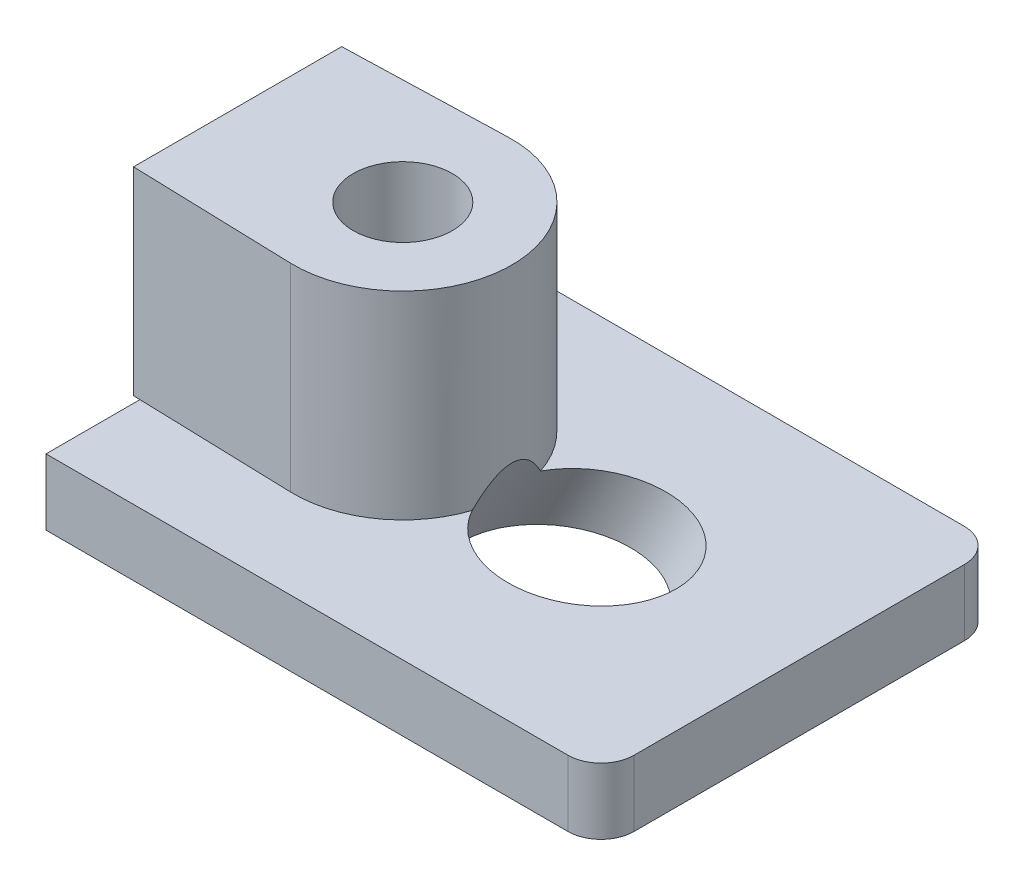
ISO-10303-21;
HEADER;
FILE_DESCRIPTION(('STEP AP214'),'2;1');
FILE_NAME('part.step','',(''),(''),'','','');
FILE_SCHEMA(('AUTOMOTIVE_DESIGN { 1 0 10303 214 1 1 1 1 }'));
ENDSEC;
DATA;
#1=APPLICATION_CONTEXT('core data for automotive mechanical design processes');
#2=APPLICATION_PROTOCOL_DEFINITION('international standard','automotive_design',2000,#1);
#3=PRODUCT_CONTEXT('',#1,'mechanical');
#4=PRODUCT('Part','Part','',(#3));
#5=PRODUCT_RELATED_PRODUCT_CATEGORY('part','',(#4));
#6=PRODUCT_DEFINITION_FORMATION('','',#4);
#7=PRODUCT_DEFINITION_CONTEXT('part definition',#1,'design');
#8=PRODUCT_DEFINITION('design','',#6,#7);
#9=PRODUCT_DEFINITION_SHAPE('','',#8);
#10=(LENGTH_UNIT() NAMED_UNIT(*) SI_UNIT(.MILLI.,.METRE.));
#11=(NAMED_UNIT(*) PLANE_ANGLE_UNIT() SI_UNIT($,.RADIAN.));
#12=(NAMED_UNIT(*) SI_UNIT($,.STERADIAN.) SOLID_ANGLE_UNIT());
#13=UNCERTAINTY_MEASURE_WITH_UNIT(LENGTH_MEASURE(1.E-05),#10,'distance_accuracy_value','');
#14=(GEOMETRIC_REPRESENTATION_CONTEXT(3) GLOBAL_UNCERTAINTY_ASSIGNED_CONTEXT((#13)) GLOBAL_UNIT_ASSIGNED_CONTEXT((#10,
#11,#12)) REPRESENTATION_CONTEXT('',''));
#15=CARTESIAN_POINT('',(0.,0.,0.));
#16=DIRECTION('',(0.,0.,1.));
#17=DIRECTION('',(1.,0.,0.));
#18=AXIS2_PLACEMENT_3D('',#15,#16,#17);
#19=CARTESIAN_POINT('',(2.5,7.75,0.));
#20=DIRECTION('',(0.,1.,0.));
#21=DIRECTION('',(0.,0.,1.));
#22=AXIS2_PLACEMENT_3D('',#19,#20,#21);
#23=PLANE('',#22);
#24=DIRECTION('',(0.,0.,-1.));
#25=VECTOR('',#24,1.);
#26=CARTESIAN_POINT('',(1.30000000001017,7.75,1.49999999996326));
#27=LINE('',#26,#25);
#28=CARTESIAN_POINT('',(1.30000000001017,7.75,0.789194940442877));
#29=VERTEX_POINT('',#28);
#30=CARTESIAN_POINT('',(1.30000000001017,7.75,-0.789194940442877));
#31=VERTEX_POINT('',#30);
#32=EDGE_CURVE('E175',#29,#31,#27,.T.);
#33=ORIENTED_EDGE('',*,*,#32,.F.);
#34=DIRECTION('',(0.99954579976556,0.,0.0301362600703334));
#35=VECTOR('',#34,1.);
#36=CARTESIAN_POINT('',(2.47513758544198,7.75,0.824625284806589));
#37=LINE('',#36,#35);
#38=CARTESIAN_POINT('',(1.25000000001017,7.75,0.787687442733547));
#39=VERTEX_POINT('',#38);
#40=EDGE_CURVE('E161',#39,#29,#37,.T.);
#41=ORIENTED_EDGE('',*,*,#40,.F.);
#42=DIRECTION('',(0.,0.,1.));
#43=VECTOR('',#42,1.);
#44=CARTESIAN_POINT('',(1.25000000001017,7.75,0.787687442733547));
#45=LINE('',#44,#43);
#46=CARTESIAN_POINT('',(1.25000000001017,7.75,-0.787687442733547));
#47=VERTEX_POINT('',#46);
#48=EDGE_CURVE('E158',#47,#39,#45,.T.);
#49=ORIENTED_EDGE('',*,*,#48,.F.);
#50=DIRECTION('',(-0.99954579976556,0.,0.0301362600703315));
#51=VECTOR('',#50,1.);
#52=CARTESIAN_POINT('',(1.25000000001017,7.75,-0.787687442733547));
#53=LINE('',#52,#51);
#54=EDGE_CURVE('E149',#31,#47,#53,.T.);
#55=ORIENTED_EDGE('',*,*,#54,.F.);
#56=EDGE_LOOP('',(#33,#41,#49,#55));
#57=FACE_BOUND('',#56,.T.);
#58=ADVANCED_FACE('F39',(#57),#23,.F.);
#59=CARTESIAN_POINT('',(2.5,9.25,0.));
#60=DIRECTION('',(0.,1.,0.));
#61=DIRECTION('',(0.,0.,1.));
#62=AXIS2_PLACEMENT_3D('',#59,#60,#61);
#63=PLANE('',#62);
#64=CARTESIAN_POINT('',(2.5,9.25,0.));
#65=DIRECTION('',(0.,1.,0.));
#66=DIRECTION('',(0.,0.,1.));
#67=AXIS2_PLACEMENT_3D('',#64,#65,#66);
#68=CIRCLE('',#67,0.825000000000001);
#69=CARTESIAN_POINT('',(2.47513758544198,9.25,0.824625284806589));
#70=VERTEX_POINT('',#69);
#71=CARTESIAN_POINT('',(2.47513758544198,9.25,-0.824625284806588));
#72=VERTEX_POINT('',#71);
#73=EDGE_CURVE('E164',#70,#72,#68,.T.);
#74=ORIENTED_EDGE('',*,*,#73,.T.);
#75=DIRECTION('',(-0.99954579976556,0.,0.0301362600703315));
#76=VECTOR('',#75,1.);
#77=CARTESIAN_POINT('',(1.25000000001017,9.25,-0.787687442733547));
#78=LINE('',#77,#76);
#79=CARTESIAN_POINT('',(1.25000000001017,9.25,-0.787687442733547));
#80=VERTEX_POINT('',#79);
#81=EDGE_CURVE('E229',#72,#80,#78,.T.);
#82=ORIENTED_EDGE('',*,*,#81,.T.);
#83=DIRECTION('',(0.,0.,1.));
#84=VECTOR('',#83,1.);
#85=CARTESIAN_POINT('',(1.25000000001017,9.25,0.787687442733547));
#86=LINE('',#85,#84);
#87=CARTESIAN_POINT('',(1.25000000001017,9.25,0.787687442733547));
#88=VERTEX_POINT('',#87);
#89=EDGE_CURVE('E230',#80,#88,#86,.T.);
#90=ORIENTED_EDGE('',*,*,#89,.T.);
#91=DIRECTION('',(0.99954579976556,0.,0.0301362600703334));
#92=VECTOR('',#91,1.);
#93=CARTESIAN_POINT('',(2.47513758544198,9.25,0.824625284806589));
#94=LINE('',#93,#92);
#95=EDGE_CURVE('E155',#88,#70,#94,.T.);
#96=ORIENTED_EDGE('',*,*,#95,.T.);
#97=EDGE_LOOP('',(#74,#82,#90,#96));
#98=FACE_BOUND('',#97,.T.);
#99=CARTESIAN_POINT('',(2.5,9.25,0.));
#100=DIRECTION('',(0.,1.,0.));
#101=DIRECTION('',(0.,0.,1.));
#102=AXIS2_PLACEMENT_3D('',#99,#100,#101);
#103=CIRCLE('',#102,0.374999999999997);
#104=CARTESIAN_POINT('',(2.5,9.25,0.374999999999998));
#105=VERTEX_POINT('',#104);
#106=EDGE_CURVE('E147',#105,#105,#103,.T.);
#107=ORIENTED_EDGE('',*,*,#106,.F.);
#108=EDGE_LOOP('',(#107));
#109=FACE_BOUND('',#108,.T.);
#110=ADVANCED_FACE('F236',(#98,#109),#63,.T.);
#111=CARTESIAN_POINT('',(2.5,9.25,0.));
#112=DIRECTION('',(0.,-1.,0.));
#113=DIRECTION('',(0.,0.,-1.));
#114=AXIS2_PLACEMENT_3D('',#111,#112,#113);
#115=CYLINDRICAL_SURFACE('',#114,0.825000000000001);
#116=CARTESIAN_POINT('',(2.5,7.75,0.));
#117=DIRECTION('',(0.,1.,0.));
#118=DIRECTION('',(0.,0.,1.));
#119=AXIS2_PLACEMENT_3D('',#116,#117,#118);
#120=CIRCLE('',#119,0.825000000000001);
#121=CARTESIAN_POINT('',(2.47513758544198,7.75,0.824625284806589));
#122=VERTEX_POINT('',#121);
#123=CARTESIAN_POINT('',(3.28350083011511,7.75,0.258363018268751));
#124=VERTEX_POINT('',#123);
#125=EDGE_CURVE('E140',#122,#124,#120,.T.);
#126=ORIENTED_EDGE('',*,*,#125,.T.);
#127=CARTESIAN_POINT('',(3.28350083011511,7.75,0.258363018268751));
#128=CARTESIAN_POINT('',(3.28699629386318,7.76737167610386,0.247717695795738));
#129=CARTESIAN_POINT('',(3.29045746397857,7.78448758146414,0.236535022142881));
#130=CARTESIAN_POINT('',(3.29729263029284,7.81815195159373,0.212408271554127));
#131=CARTESIAN_POINT('',(3.30066185739445,7.83467320491001,0.199425248176803));
#132=CARTESIAN_POINT('',(3.30711403044603,7.86619807139703,0.171461122570829));
#133=CARTESIAN_POINT('',(3.3101953340927,7.88119301733646,0.156469620021037));
#134=CARTESIAN_POINT('',(3.31577706571615,7.90827880066202,0.12409020915238));
#135=CARTESIAN_POINT('',(3.31828357965726,7.92040011589495,0.106730843363557));
#136=CARTESIAN_POINT('',(3.32127084558138,7.9348215765627,0.078888319291892));
#137=CARTESIAN_POINT('',(3.32213260135721,7.93897685197716,0.0694173488184401));
#138=CARTESIAN_POINT('',(3.32354615738824,7.94578891480867,0.0499200886748));
#139=CARTESIAN_POINT('',(3.32409815277136,7.94844664558094,0.0398941529782842));
#140=CARTESIAN_POINT('',(3.32483491132341,7.95199328219456,0.0194333412467662));
#141=CARTESIAN_POINT('',(3.32501688143136,7.9528687349283,0.00899595677292852));
#142=CARTESIAN_POINT('',(3.32498062707693,7.95269427559985,-0.0118633448696995));
#143=CARTESIAN_POINT('',(3.3247623547405,7.95164413321211,-0.0222852600389345));
#144=CARTESIAN_POINT('',(3.32398893632226,7.94792075450384,-0.0419008258318313));
#145=CARTESIAN_POINT('',(3.32346365554792,7.94539140172208,-0.051124074716937));
#146=CARTESIAN_POINT('',(3.32215104739102,7.93906567007573,-0.0690934351013585));
#147=CARTESIAN_POINT('',(3.32136374259963,7.93526940044204,-0.0778395876593046));
#148=CARTESIAN_POINT('',(3.31897190754394,7.92372402533821,-0.100578862908204));
#149=CARTESIAN_POINT('',(3.31717642734045,7.91504579337111,-0.114077082987651));
#150=CARTESIAN_POINT('',(3.31319719530162,7.89576674373529,-0.139658737731793));
#151=CARTESIAN_POINT('',(3.31101040177495,7.88515085059979,-0.151729761073551));
#152=CARTESIAN_POINT('',(3.30488396314836,7.8553267768583,-0.182105092880801));
#153=CARTESIAN_POINT('',(3.30073520753249,7.83504904238653,-0.199306386547059));
#154=CARTESIAN_POINT('',(3.29433648114911,7.80360095863935,-0.222974308083464));
#155=CARTESIAN_POINT('',(3.29220407060575,7.79309406405001,-0.23042152060526));
#156=CARTESIAN_POINT('',(3.28788815438002,7.77176907325318,-0.244771662623246));
#157=CARTESIAN_POINT('',(3.28570481309643,7.76095195786056,-0.25167609438423));
#158=CARTESIAN_POINT('',(3.28350083011511,7.75,-0.25836301826875));
#159=B_SPLINE_CURVE_WITH_KNOTS('',3,(#127,#128,#129,#130,#131,#132,#133,#134,#135,#136,#137,
#138,#139,#140,#141,#142,#143,#144,#145,#146,#147,#148,#149,#150,#151,#152,#153,#154,#155,#156,
#157,#158),.UNSPECIFIED.,.F.,.F.,(4,2,2,2,2,2,2,2,2,2,2,2,2,2,2,4),(0.,0.062094270264768,
0.125840542327223,0.189930676463519,0.25330717207321,0.28433894797483,0.315351153969684,
0.346596593157475,0.377845769939032,0.406467691734564,0.435087146445606,0.483247703954784,
0.531800305579684,0.612190537944448,0.651346958262196,0.690390881410285),.UNSPECIFIED.);
#160=CARTESIAN_POINT('',(3.28350083011511,7.75,-0.25836301826875));
#161=VERTEX_POINT('',#160);
#162=EDGE_CURVE('E54',#124,#161,#159,.T.);
#163=ORIENTED_EDGE('',*,*,#162,.T.);
#164=CARTESIAN_POINT('',(2.47513758544198,7.75,-0.824625284806588));
#165=VERTEX_POINT('',#164);
#166=EDGE_CURVE('E137',#161,#165,#120,.T.);
#167=ORIENTED_EDGE('',*,*,#166,.T.);
#168=DIRECTION('',(0.,-1.,0.));
#169=VECTOR('',#168,1.);
#170=CARTESIAN_POINT('',(2.47513758544198,9.25,-0.824625284806588));
#171=LINE('',#170,#169);
#172=EDGE_CURVE('E173',#72,#165,#171,.T.);
#173=ORIENTED_EDGE('',*,*,#172,.F.);
#174=ORIENTED_EDGE('',*,*,#73,.F.);
#175=DIRECTION('',(0.,-1.,0.));
#176=VECTOR('',#175,1.);
#177=CARTESIAN_POINT('',(2.47513758544198,9.25,0.824625284806589));
#178=LINE('',#177,#176);
#179=EDGE_CURVE('E165',#70,#122,#178,.T.);
#180=ORIENTED_EDGE('',*,*,#179,.T.);
#181=EDGE_LOOP('',(#126,#163,#167,#173,#174,#180));
#182=FACE_BOUND('',#181,.T.);
#183=ADVANCED_FACE('F135',(#182),#115,.T.);
#184=CARTESIAN_POINT('',(1.25000000001017,9.25,-0.787687442733547));
#185=DIRECTION('',(0.0301362600703315,0.,0.99954579976556));
#186=DIRECTION('',(0.99954579976556,0.,-0.0301362600703315));
#187=AXIS2_PLACEMENT_3D('',#184,#185,#186);
#188=PLANE('',#187);
#189=EDGE_CURVE('E146',#165,#31,#53,.T.);
#190=ORIENTED_EDGE('',*,*,#189,.T.);
#191=ORIENTED_EDGE('',*,*,#54,.T.);
#192=DIRECTION('',(0.,-1.,0.));
#193=VECTOR('',#192,1.);
#194=CARTESIAN_POINT('',(1.25000000001017,9.25,-0.787687442733547));
#195=LINE('',#194,#193);
#196=EDGE_CURVE('E170',#80,#47,#195,.T.);
#197=ORIENTED_EDGE('',*,*,#196,.F.);
#198=ORIENTED_EDGE('',*,*,#81,.F.);
#199=ORIENTED_EDGE('',*,*,#172,.T.);
#200=EDGE_LOOP('',(#190,#191,#197,#198,#199));
#201=FACE_BOUND('',#200,.T.);
#202=ADVANCED_FACE('F243',(#201),#188,.F.);
#203=CARTESIAN_POINT('',(1.25000000001017,9.25,0.787687442733547));
#204=DIRECTION('',(1.,0.,0.));
#205=DIRECTION('',(0.,0.,-1.));
#206=AXIS2_PLACEMENT_3D('',#203,#204,#205);
#207=PLANE('',#206);
#208=ORIENTED_EDGE('',*,*,#48,.T.);
#209=DIRECTION('',(0.,-1.,0.));
#210=VECTOR('',#209,1.);
#211=CARTESIAN_POINT('',(1.25000000001017,9.25,0.787687442733547));
#212=LINE('',#211,#210);
#213=EDGE_CURVE('E167',#88,#39,#212,.T.);
#214=ORIENTED_EDGE('',*,*,#213,.F.);
#215=ORIENTED_EDGE('',*,*,#89,.F.);
#216=ORIENTED_EDGE('',*,*,#196,.T.);
#217=EDGE_LOOP('',(#208,#214,#215,#216));
#218=FACE_BOUND('',#217,.T.);
#219=ADVANCED_FACE('F248',(#218),#207,.F.);
#220=CARTESIAN_POINT('',(2.47513758544198,9.25,0.824625284806589));
#221=DIRECTION('',(0.0301362600703333,0.,-0.99954579976556));
#222=DIRECTION('',(-0.99954579976556,0.,-0.0301362600703334));
#223=AXIS2_PLACEMENT_3D('',#220,#221,#222);
#224=PLANE('',#223);
#225=ORIENTED_EDGE('',*,*,#40,.T.);
#226=EDGE_CURVE('E160',#29,#122,#37,.T.);
#227=ORIENTED_EDGE('',*,*,#226,.T.);
#228=ORIENTED_EDGE('',*,*,#179,.F.);
#229=ORIENTED_EDGE('',*,*,#95,.F.);
#230=ORIENTED_EDGE('',*,*,#213,.T.);
#231=EDGE_LOOP('',(#225,#227,#228,#229,#230));
#232=FACE_BOUND('',#231,.T.);
#233=ADVANCED_FACE('F240',(#232),#224,.F.);
#234=CARTESIAN_POINT('',(2.5,9.25,0.));
#235=DIRECTION('',(0.,-1.,0.));
#236=DIRECTION('',(0.,0.,-1.));
#237=AXIS2_PLACEMENT_3D('',#234,#235,#236);
#238=CYLINDRICAL_SURFACE('',#237,0.374999999999997);
#239=ORIENTED_EDGE('',*,*,#106,.T.);
#240=EDGE_LOOP('',(#239));
#241=FACE_BOUND('',#240,.T.);
#242=CARTESIAN_POINT('',(2.5,7.75,0.));
#243=DIRECTION('',(0.,1.,0.));
#244=DIRECTION('',(0.,0.,1.));
#245=AXIS2_PLACEMENT_3D('',#242,#243,#244);
#246=CIRCLE('',#245,0.374999999999997);
#247=CARTESIAN_POINT('',(2.5,7.75,0.374999999999998));
#248=VERTEX_POINT('',#247);
#249=EDGE_CURVE('E151',#248,#248,#246,.T.);
#250=ORIENTED_EDGE('',*,*,#249,.F.);
#251=EDGE_LOOP('',(#250));
#252=FACE_BOUND('',#251,.T.);
#253=ADVANCED_FACE('F279',(#241,#252),#238,.F.);
#254=CARTESIAN_POINT('',(0.,7.75,0.));
#255=DIRECTION('',(0.,-1.,0.));
#256=DIRECTION('',(1.,0.,0.));
#257=AXIS2_PLACEMENT_3D('',#254,#255,#256);
#258=PLANE('',#257);
#259=ORIENTED_EDGE('',*,*,#166,.F.);
#260=CARTESIAN_POINT('',(3.89333333334351,7.75,0.));
#261=DIRECTION('',(0.,-1.,0.));
#262=DIRECTION('',(1.,0.,0.));
#263=AXIS2_PLACEMENT_3D('',#260,#261,#262);
#264=ELLIPSE('',#263,0.676486666600938,0.596899999942004);
#265=EDGE_CURVE('E127',#161,#124,#264,.T.);
#266=ORIENTED_EDGE('',*,*,#265,.T.);
#267=ORIENTED_EDGE('',*,*,#125,.F.);
#268=ORIENTED_EDGE('',*,*,#226,.F.);
#269=CARTESIAN_POINT('',(1.30000000001017,7.75,1.49999999996326));
#270=VERTEX_POINT('',#269);
#271=EDGE_CURVE('E214',#270,#29,#27,.T.);
#272=ORIENTED_EDGE('',*,*,#271,.F.);
#273=DIRECTION('',(-1.,0.,0.));
#274=VECTOR('',#273,1.);
#275=CARTESIAN_POINT('',(5.50000000001019,7.75,1.49999999996326));
#276=LINE('',#275,#274);
#277=CARTESIAN_POINT('',(5.25000000001019,7.75,1.49999999996326));
#278=VERTEX_POINT('',#277);
#279=EDGE_CURVE('E253',#278,#270,#276,.T.);
#280=ORIENTED_EDGE('',*,*,#279,.F.);
#281=CARTESIAN_POINT('',(5.25000000001019,7.75,1.24999999996326));
#282=DIRECTION('',(0.,-1.,0.));
#283=DIRECTION('',(1.,0.,0.));
#284=AXIS2_PLACEMENT_3D('',#281,#282,#283);
#285=CIRCLE('',#284,0.25);
#286=CARTESIAN_POINT('',(5.50000000001019,7.75,1.24999999996326));
#287=VERTEX_POINT('',#286);
#288=EDGE_CURVE('E181',#278,#287,#285,.F.);
#289=ORIENTED_EDGE('',*,*,#288,.T.);
#290=DIRECTION('',(0.,0.,1.));
#291=VECTOR('',#290,1.);
#292=CARTESIAN_POINT('',(5.50000000001019,7.75,1.49999999996326));
#293=LINE('',#292,#291);
#294=CARTESIAN_POINT('',(5.50000000001019,7.75,-1.25000000003674));
#295=VERTEX_POINT('',#294);
#296=EDGE_CURVE('E141',#295,#287,#293,.T.);
#297=ORIENTED_EDGE('',*,*,#296,.F.);
#298=CARTESIAN_POINT('',(5.25000000001019,7.75,-1.25000000003674));
#299=DIRECTION('',(0.,-1.,0.));
#300=DIRECTION('',(1.,0.,0.));
#301=AXIS2_PLACEMENT_3D('',#298,#299,#300);
#302=CIRCLE('',#301,0.25);
#303=CARTESIAN_POINT('',(5.25000000001019,7.75,-1.50000000003674));
#304=VERTEX_POINT('',#303);
#305=EDGE_CURVE('E183',#295,#304,#302,.F.);
#306=ORIENTED_EDGE('',*,*,#305,.T.);
#307=DIRECTION('',(1.,0.,0.));
#308=VECTOR('',#307,1.);
#309=CARTESIAN_POINT('',(1.30000000001017,7.75,-1.50000000003674));
#310=LINE('',#309,#308);
#311=CARTESIAN_POINT('',(1.30000000001017,7.75,-1.50000000003674));
#312=VERTEX_POINT('',#311);
#313=EDGE_CURVE('E204',#312,#304,#310,.T.);
#314=ORIENTED_EDGE('',*,*,#313,.F.);
#315=EDGE_CURVE('E217',#31,#312,#27,.T.);
#316=ORIENTED_EDGE('',*,*,#315,.F.);
#317=ORIENTED_EDGE('',*,*,#189,.F.);
#318=EDGE_LOOP('',(#259,#266,#267,#268,#272,#280,#289,#297,#306,#314,#316,#317));
#319=FACE_BOUND('',#318,.T.);
#320=ADVANCED_FACE('F144',(#319),#258,.F.);
#321=CARTESIAN_POINT('',(0.,7.25,0.));
#322=DIRECTION('',(0.,-1.,0.));
#323=DIRECTION('',(1.,0.,0.));
#324=AXIS2_PLACEMENT_3D('',#321,#322,#323);
#325=PLANE('',#324);
#326=CARTESIAN_POINT('',(3.62666666667684,7.25,0.));
#327=DIRECTION('',(0.,-1.,0.));
#328=DIRECTION('',(1.,0.,0.));
#329=AXIS2_PLACEMENT_3D('',#326,#327,#328);
#330=ELLIPSE('',#329,0.676486666600938,0.596899999942004);
#331=CARTESIAN_POINT('',(4.30315333327778,7.25,0.));
#332=VERTEX_POINT('',#331);
#333=EDGE_CURVE('E43',#332,#332,#330,.T.);
#334=ORIENTED_EDGE('',*,*,#333,.F.);
#335=EDGE_LOOP('',(#334));
#336=FACE_BOUND('',#335,.T.);
#337=DIRECTION('',(1.,0.,0.));
#338=VECTOR('',#337,1.);
#339=CARTESIAN_POINT('',(1.30000000001017,7.25,-1.50000000003674));
#340=LINE('',#339,#338);
#341=CARTESIAN_POINT('',(1.30000000001017,7.25,-1.50000000003674));
#342=VERTEX_POINT('',#341);
#343=CARTESIAN_POINT('',(5.25000000001019,7.25,-1.50000000003674));
#344=VERTEX_POINT('',#343);
#345=EDGE_CURVE('E194',#342,#344,#340,.T.);
#346=ORIENTED_EDGE('',*,*,#345,.T.);
#347=CARTESIAN_POINT('',(5.25000000001019,7.25,-1.25000000003674));
#348=DIRECTION('',(0.,-1.,0.));
#349=DIRECTION('',(1.,0.,0.));
#350=AXIS2_PLACEMENT_3D('',#347,#348,#349);
#351=CIRCLE('',#350,0.25);
#352=CARTESIAN_POINT('',(5.50000000001019,7.25,-1.25000000003674));
#353=VERTEX_POINT('',#352);
#354=EDGE_CURVE('E48',#344,#353,#351,.T.);
#355=ORIENTED_EDGE('',*,*,#354,.T.);
#356=DIRECTION('',(0.,0.,1.));
#357=VECTOR('',#356,1.);
#358=CARTESIAN_POINT('',(5.50000000001019,7.25,1.49999999996326));
#359=LINE('',#358,#357);
#360=CARTESIAN_POINT('',(5.50000000001019,7.25,1.24999999996326));
#361=VERTEX_POINT('',#360);
#362=EDGE_CURVE('E192',#353,#361,#359,.T.);
#363=ORIENTED_EDGE('',*,*,#362,.T.);
#364=CARTESIAN_POINT('',(5.25000000001019,7.25,1.24999999996326));
#365=DIRECTION('',(0.,-1.,0.));
#366=DIRECTION('',(1.,0.,0.));
#367=AXIS2_PLACEMENT_3D('',#364,#365,#366);
#368=CIRCLE('',#367,0.25);
#369=CARTESIAN_POINT('',(5.25000000001019,7.25,1.49999999996326));
#370=VERTEX_POINT('',#369);
#371=EDGE_CURVE('E62',#361,#370,#368,.T.);
#372=ORIENTED_EDGE('',*,*,#371,.T.);
#373=DIRECTION('',(-1.,0.,0.));
#374=VECTOR('',#373,1.);
#375=CARTESIAN_POINT('',(5.50000000001019,7.25,1.49999999996326));
#376=LINE('',#375,#374);
#377=CARTESIAN_POINT('',(1.30000000001017,7.25,1.49999999996326));
#378=VERTEX_POINT('',#377);
#379=EDGE_CURVE('E203',#370,#378,#376,.T.);
#380=ORIENTED_EDGE('',*,*,#379,.T.);
#381=DIRECTION('',(0.,0.,-1.));
#382=VECTOR('',#381,1.);
#383=CARTESIAN_POINT('',(1.30000000001017,7.25,1.49999999996326));
#384=LINE('',#383,#382);
#385=EDGE_CURVE('E260',#378,#342,#384,.T.);
#386=ORIENTED_EDGE('',*,*,#385,.T.);
#387=EDGE_LOOP('',(#346,#355,#363,#372,#380,#386));
#388=FACE_BOUND('',#387,.T.);
#389=ADVANCED_FACE('F191',(#336,#388),#325,.T.);
#390=CARTESIAN_POINT('',(1.30000000001017,7.25,-1.50000000003674));
#391=DIRECTION('',(0.,0.,1.));
#392=DIRECTION('',(0.,-1.,0.));
#393=AXIS2_PLACEMENT_3D('',#390,#391,#392);
#394=PLANE('',#393);
#395=ORIENTED_EDGE('',*,*,#313,.T.);
#396=DIRECTION('',(0.,1.,0.));
#397=VECTOR('',#396,1.);
#398=CARTESIAN_POINT('',(5.25000000001019,7.25,-1.50000000003674));
#399=LINE('',#398,#397);
#400=EDGE_CURVE('E185',#304,#344,#399,.F.);
#401=ORIENTED_EDGE('',*,*,#400,.T.);
#402=ORIENTED_EDGE('',*,*,#345,.F.);
#403=DIRECTION('',(0.,1.,0.));
#404=VECTOR('',#403,1.);
#405=CARTESIAN_POINT('',(1.30000000001017,7.25,-1.50000000003674));
#406=LINE('',#405,#404);
#407=EDGE_CURVE('E213',#342,#312,#406,.T.);
#408=ORIENTED_EDGE('',*,*,#407,.T.);
#409=EDGE_LOOP('',(#395,#401,#402,#408));
#410=FACE_BOUND('',#409,.T.);
#411=ADVANCED_FACE('F211',(#410),#394,.F.);
#412=CARTESIAN_POINT('',(1.30000000001017,7.25,1.49999999996326));
#413=DIRECTION('',(1.,0.,0.));
#414=DIRECTION('',(0.,0.,-1.));
#415=AXIS2_PLACEMENT_3D('',#412,#413,#414);
#416=PLANE('',#415);
#417=ORIENTED_EDGE('',*,*,#271,.T.);
#418=ORIENTED_EDGE('',*,*,#32,.T.);
#419=ORIENTED_EDGE('',*,*,#315,.T.);
#420=ORIENTED_EDGE('',*,*,#407,.F.);
#421=ORIENTED_EDGE('',*,*,#385,.F.);
#422=DIRECTION('',(0.,1.,0.));
#423=VECTOR('',#422,1.);
#424=CARTESIAN_POINT('',(1.30000000001017,7.25,1.49999999996326));
#425=LINE('',#424,#423);
#426=EDGE_CURVE('E222',#378,#270,#425,.T.);
#427=ORIENTED_EDGE('',*,*,#426,.T.);
#428=EDGE_LOOP('',(#417,#418,#419,#420,#421,#427));
#429=FACE_BOUND('',#428,.T.);
#430=ADVANCED_FACE('F283',(#429),#416,.F.);
#431=CARTESIAN_POINT('',(5.50000000001019,7.25,1.49999999996326));
#432=DIRECTION('',(0.,0.,-1.));
#433=DIRECTION('',(-1.,0.,0.));
#434=AXIS2_PLACEMENT_3D('',#431,#432,#433);
#435=PLANE('',#434);
#436=ORIENTED_EDGE('',*,*,#379,.F.);
#437=DIRECTION('',(0.,1.,0.));
#438=VECTOR('',#437,1.);
#439=CARTESIAN_POINT('',(5.25000000001019,7.25,1.49999999996326));
#440=LINE('',#439,#438);
#441=EDGE_CURVE('E11',#370,#278,#440,.T.);
#442=ORIENTED_EDGE('',*,*,#441,.T.);
#443=ORIENTED_EDGE('',*,*,#279,.T.);
#444=ORIENTED_EDGE('',*,*,#426,.F.);
#445=EDGE_LOOP('',(#436,#442,#443,#444));
#446=FACE_BOUND('',#445,.T.);
#447=ADVANCED_FACE('F286',(#446),#435,.F.);
#448=CARTESIAN_POINT('',(5.50000000001019,7.25,1.49999999996326));
#449=DIRECTION('',(-1.,0.,0.));
#450=DIRECTION('',(0.,-1.,0.));
#451=AXIS2_PLACEMENT_3D('',#448,#449,#450);
#452=PLANE('',#451);
#453=ORIENTED_EDGE('',*,*,#362,.F.);
#454=DIRECTION('',(0.,1.,0.));
#455=VECTOR('',#454,1.);
#456=CARTESIAN_POINT('',(5.50000000001019,7.25,-1.25000000003674));
#457=LINE('',#456,#455);
#458=EDGE_CURVE('E178',#353,#295,#457,.T.);
#459=ORIENTED_EDGE('',*,*,#458,.T.);
#460=ORIENTED_EDGE('',*,*,#296,.T.);
#461=DIRECTION('',(0.,1.,0.));
#462=VECTOR('',#461,1.);
#463=CARTESIAN_POINT('',(5.50000000001019,7.25,1.24999999996326));
#464=LINE('',#463,#462);
#465=EDGE_CURVE('E176',#287,#361,#464,.F.);
#466=ORIENTED_EDGE('',*,*,#465,.T.);
#467=EDGE_LOOP('',(#453,#459,#460,#466));
#468=FACE_BOUND('',#467,.T.);
#469=ADVANCED_FACE('F199',(#468),#452,.F.);
#470=ORIENTED_EDGE('',*,*,#249,.T.);
#471=EDGE_LOOP('',(#470));
#472=FACE_BOUND('',#471,.T.);
#473=ADVANCED_FACE('F280',(#472),#258,.F.);
#474=CARTESIAN_POINT('',(5.25000000001019,7.25,-1.25000000003674));
#475=DIRECTION('',(0.,1.,0.));
#476=DIRECTION('',(-1.,0.,0.));
#477=AXIS2_PLACEMENT_3D('',#474,#475,#476);
#478=CYLINDRICAL_SURFACE('',#477,0.25);
#479=ORIENTED_EDGE('',*,*,#354,.F.);
#480=ORIENTED_EDGE('',*,*,#400,.F.);
#481=ORIENTED_EDGE('',*,*,#305,.F.);
#482=ORIENTED_EDGE('',*,*,#458,.F.);
#483=EDGE_LOOP('',(#479,#480,#481,#482));
#484=FACE_BOUND('',#483,.T.);
#485=ADVANCED_FACE('F206',(#484),#478,.T.);
#486=CARTESIAN_POINT('',(5.25000000001019,7.25,1.24999999996326));
#487=DIRECTION('',(0.,1.,0.));
#488=DIRECTION('',(-1.,0.,0.));
#489=AXIS2_PLACEMENT_3D('',#486,#487,#488);
#490=CYLINDRICAL_SURFACE('',#489,0.25);
#491=ORIENTED_EDGE('',*,*,#371,.F.);
#492=ORIENTED_EDGE('',*,*,#465,.F.);
#493=ORIENTED_EDGE('',*,*,#288,.F.);
#494=ORIENTED_EDGE('',*,*,#441,.F.);
#495=EDGE_LOOP('',(#491,#492,#493,#494));
#496=FACE_BOUND('',#495,.T.);
#497=ADVANCED_FACE('F41',(#496),#490,.T.);
#498=CARTESIAN_POINT('',(0.352941176480773,1.11176470588236,0.));
#499=DIRECTION('',(0.470588235294117,0.882352941176471,0.));
#500=DIRECTION('',(-0.882352941176471,0.470588235294117,0.));
#501=AXIS2_PLACEMENT_3D('',#498,#499,#500);
#502=CYLINDRICAL_SURFACE('',#501,0.596899999942004);
#503=ORIENTED_EDGE('',*,*,#333,.T.);
#504=EDGE_LOOP('',(#503));
#505=FACE_BOUND('',#504,.T.);
#506=ORIENTED_EDGE('',*,*,#265,.F.);
#507=ORIENTED_EDGE('',*,*,#162,.F.);
#508=EDGE_LOOP('',(#506,#507));
#509=FACE_BOUND('',#508,.T.);
#510=ADVANCED_FACE('F128',(#505,#509),#502,.F.);
#511=CLOSED_SHELL('',(#58,#110,#183,#202,#219,#233,#253,#320,#389,#411,#430,#447,#469,#473,#485,
#497,#510));
#512=MANIFOLD_SOLID_BREP('B2',#511);
#513=ADVANCED_BREP_SHAPE_REPRESENTATION('',(#18,#512),#14);
#514=SHAPE_DEFINITION_REPRESENTATION(#9,#513);
ENDSEC;
END-ISO-10303-21;
